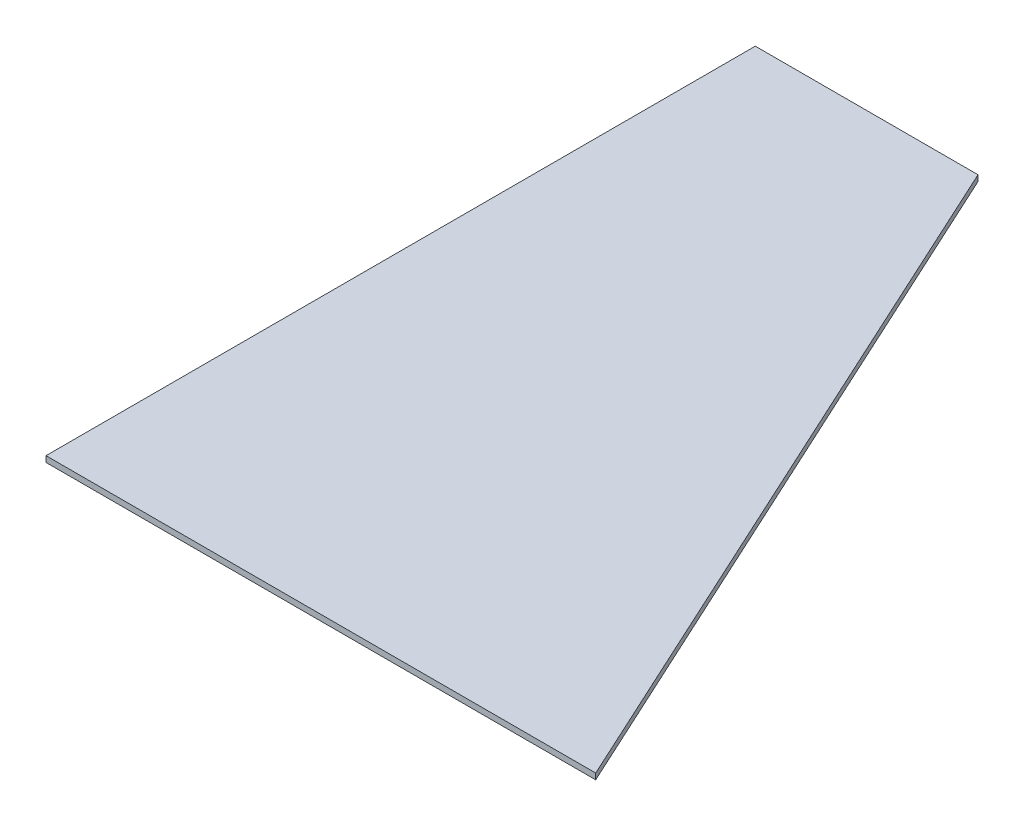
ISO-10303-21;
HEADER;
FILE_DESCRIPTION(('STEP AP214'),'2;1');
FILE_NAME('part.step','',(''),(''),'','','');
FILE_SCHEMA(('AUTOMOTIVE_DESIGN { 1 0 10303 214 1 1 1 1 }'));
ENDSEC;
DATA;
#1=APPLICATION_CONTEXT('core data for automotive mechanical design processes');
#2=APPLICATION_PROTOCOL_DEFINITION('international standard','automotive_design',2000,#1);
#3=PRODUCT_CONTEXT('',#1,'mechanical');
#4=PRODUCT('Part','Part','',(#3));
#5=PRODUCT_RELATED_PRODUCT_CATEGORY('part','',(#4));
#6=PRODUCT_DEFINITION_FORMATION('','',#4);
#7=PRODUCT_DEFINITION_CONTEXT('part definition',#1,'design');
#8=PRODUCT_DEFINITION('design','',#6,#7);
#9=PRODUCT_DEFINITION_SHAPE('','',#8);
#10=(LENGTH_UNIT() NAMED_UNIT(*) SI_UNIT(.MILLI.,.METRE.));
#11=(NAMED_UNIT(*) PLANE_ANGLE_UNIT() SI_UNIT($,.RADIAN.));
#12=(NAMED_UNIT(*) SI_UNIT($,.STERADIAN.) SOLID_ANGLE_UNIT());
#13=UNCERTAINTY_MEASURE_WITH_UNIT(LENGTH_MEASURE(1.E-05),#10,'distance_accuracy_value','');
#14=(GEOMETRIC_REPRESENTATION_CONTEXT(3) GLOBAL_UNCERTAINTY_ASSIGNED_CONTEXT((#13)) GLOBAL_UNIT_ASSIGNED_CONTEXT((#10,
#11,#12)) REPRESENTATION_CONTEXT('',''));
#15=CARTESIAN_POINT('',(0.,0.,0.));
#16=DIRECTION('',(0.,0.,1.));
#17=DIRECTION('',(1.,0.,0.));
#18=AXIS2_PLACEMENT_3D('',#15,#16,#17);
#19=CARTESIAN_POINT('',(0.,6.35,-762.));
#20=DIRECTION('',(1.,0.,0.));
#21=DIRECTION('',(0.,0.,-1.));
#22=AXIS2_PLACEMENT_3D('',#19,#20,#21);
#23=PLANE('',#22);
#24=DIRECTION('',(0.,0.,1.));
#25=VECTOR('',#24,1.);
#26=CARTESIAN_POINT('',(0.,0.,-762.));
#27=LINE('',#26,#25);
#28=CARTESIAN_POINT('',(0.,0.,-762.));
#29=VERTEX_POINT('',#28);
#30=CARTESIAN_POINT('',(0.,0.,0.));
#31=VERTEX_POINT('',#30);
#32=EDGE_CURVE('E100',#29,#31,#27,.T.);
#33=ORIENTED_EDGE('',*,*,#32,.T.);
#34=DIRECTION('',(0.,-1.,0.));
#35=VECTOR('',#34,1.);
#36=CARTESIAN_POINT('',(0.,6.35,0.));
#37=LINE('',#36,#35);
#38=CARTESIAN_POINT('',(0.,6.35,0.));
#39=VERTEX_POINT('',#38);
#40=EDGE_CURVE('E11',#39,#31,#37,.T.);
#41=ORIENTED_EDGE('',*,*,#40,.F.);
#42=DIRECTION('',(0.,0.,1.));
#43=VECTOR('',#42,1.);
#44=CARTESIAN_POINT('',(0.,6.35,-762.));
#45=LINE('',#44,#43);
#46=CARTESIAN_POINT('',(0.,6.35,-762.));
#47=VERTEX_POINT('',#46);
#48=EDGE_CURVE('E88',#47,#39,#45,.T.);
#49=ORIENTED_EDGE('',*,*,#48,.F.);
#50=DIRECTION('',(0.,-1.,0.));
#51=VECTOR('',#50,1.);
#52=CARTESIAN_POINT('',(0.,6.35,-762.));
#53=LINE('',#52,#51);
#54=EDGE_CURVE('E96',#47,#29,#53,.T.);
#55=ORIENTED_EDGE('',*,*,#54,.T.);
#56=EDGE_LOOP('',(#33,#41,#49,#55));
#57=FACE_BOUND('',#56,.T.);
#58=ADVANCED_FACE('F37',(#57),#23,.F.);
#59=CARTESIAN_POINT('',(0.,6.35,0.));
#60=DIRECTION('',(0.,0.,-1.));
#61=DIRECTION('',(-1.,0.,0.));
#62=AXIS2_PLACEMENT_3D('',#59,#60,#61);
#63=PLANE('',#62);
#64=DIRECTION('',(1.,0.,0.));
#65=VECTOR('',#64,1.);
#66=CARTESIAN_POINT('',(0.,0.,0.));
#67=LINE('',#66,#65);
#68=CARTESIAN_POINT('',(590.55,0.,0.));
#69=VERTEX_POINT('',#68);
#70=EDGE_CURVE('E92',#31,#69,#67,.T.);
#71=ORIENTED_EDGE('',*,*,#70,.T.);
#72=DIRECTION('',(0.,-1.,0.));
#73=VECTOR('',#72,1.);
#74=CARTESIAN_POINT('',(590.55,6.35,0.));
#75=LINE('',#74,#73);
#76=CARTESIAN_POINT('',(590.55,6.35,0.));
#77=VERTEX_POINT('',#76);
#78=EDGE_CURVE('E45',#77,#69,#75,.T.);
#79=ORIENTED_EDGE('',*,*,#78,.F.);
#80=DIRECTION('',(1.,0.,0.));
#81=VECTOR('',#80,1.);
#82=CARTESIAN_POINT('',(0.,6.35,0.));
#83=LINE('',#82,#81);
#84=EDGE_CURVE('E83',#39,#77,#83,.T.);
#85=ORIENTED_EDGE('',*,*,#84,.F.);
#86=ORIENTED_EDGE('',*,*,#40,.T.);
#87=EDGE_LOOP('',(#71,#79,#85,#86));
#88=FACE_BOUND('',#87,.T.);
#89=ADVANCED_FACE('F91',(#88),#63,.F.);
#90=CARTESIAN_POINT('',(590.55,6.35,0.));
#91=DIRECTION('',(-0.908143173825079,0.,0.418659737537432));
#92=DIRECTION('',(0.418659737537432,0.,0.908143173825079));
#93=AXIS2_PLACEMENT_3D('',#90,#91,#92);
#94=PLANE('',#93);
#95=DIRECTION('',(-0.418659737537432,0.,-0.90814317382508));
#96=VECTOR('',#95,1.);
#97=CARTESIAN_POINT('',(590.55,0.,0.));
#98=LINE('',#97,#96);
#99=CARTESIAN_POINT('',(239.26318840638,0.,-762.));
#100=VERTEX_POINT('',#99);
#101=EDGE_CURVE('E70',#69,#100,#98,.T.);
#102=ORIENTED_EDGE('',*,*,#101,.T.);
#103=DIRECTION('',(0.,-1.,0.));
#104=VECTOR('',#103,1.);
#105=CARTESIAN_POINT('',(239.26318840638,6.35,-762.));
#106=LINE('',#105,#104);
#107=CARTESIAN_POINT('',(239.26318840638,6.35,-762.));
#108=VERTEX_POINT('',#107);
#109=EDGE_CURVE('E93',#108,#100,#106,.T.);
#110=ORIENTED_EDGE('',*,*,#109,.F.);
#111=DIRECTION('',(-0.418659737537432,0.,-0.90814317382508));
#112=VECTOR('',#111,1.);
#113=CARTESIAN_POINT('',(590.55,6.35,0.));
#114=LINE('',#113,#112);
#115=EDGE_CURVE('E86',#77,#108,#114,.T.);
#116=ORIENTED_EDGE('',*,*,#115,.F.);
#117=ORIENTED_EDGE('',*,*,#78,.T.);
#118=EDGE_LOOP('',(#102,#110,#116,#117));
#119=FACE_BOUND('',#118,.T.);
#120=ADVANCED_FACE('F94',(#119),#94,.F.);
#121=CARTESIAN_POINT('',(239.26318840638,6.35,-762.));
#122=DIRECTION('',(0.,0.,1.));
#123=DIRECTION('',(1.,0.,0.));
#124=AXIS2_PLACEMENT_3D('',#121,#122,#123);
#125=PLANE('',#124);
#126=DIRECTION('',(-1.,0.,0.));
#127=VECTOR('',#126,1.);
#128=CARTESIAN_POINT('',(239.26318840638,0.,-762.));
#129=LINE('',#128,#127);
#130=EDGE_CURVE('E76',#100,#29,#129,.T.);
#131=ORIENTED_EDGE('',*,*,#130,.T.);
#132=ORIENTED_EDGE('',*,*,#54,.F.);
#133=DIRECTION('',(-1.,0.,0.));
#134=VECTOR('',#133,1.);
#135=CARTESIAN_POINT('',(239.26318840638,6.35,-762.));
#136=LINE('',#135,#134);
#137=EDGE_CURVE('E53',#108,#47,#136,.T.);
#138=ORIENTED_EDGE('',*,*,#137,.F.);
#139=ORIENTED_EDGE('',*,*,#109,.T.);
#140=EDGE_LOOP('',(#131,#132,#138,#139));
#141=FACE_BOUND('',#140,.T.);
#142=ADVANCED_FACE('F107',(#141),#125,.F.);
#143=CARTESIAN_POINT('',(0.,6.35,0.));
#144=DIRECTION('',(0.,1.,0.));
#145=DIRECTION('',(0.,0.,1.));
#146=AXIS2_PLACEMENT_3D('',#143,#144,#145);
#147=PLANE('',#146);
#148=ORIENTED_EDGE('',*,*,#48,.T.);
#149=ORIENTED_EDGE('',*,*,#84,.T.);
#150=ORIENTED_EDGE('',*,*,#115,.T.);
#151=ORIENTED_EDGE('',*,*,#137,.T.);
#152=EDGE_LOOP('',(#148,#149,#150,#151));
#153=FACE_BOUND('',#152,.T.);
#154=ADVANCED_FACE('F84',(#153),#147,.T.);
#155=CARTESIAN_POINT('',(0.,0.,0.));
#156=DIRECTION('',(0.,1.,0.));
#157=DIRECTION('',(0.,0.,1.));
#158=AXIS2_PLACEMENT_3D('',#155,#156,#157);
#159=PLANE('',#158);
#160=ORIENTED_EDGE('',*,*,#32,.F.);
#161=ORIENTED_EDGE('',*,*,#130,.F.);
#162=ORIENTED_EDGE('',*,*,#101,.F.);
#163=ORIENTED_EDGE('',*,*,#70,.F.);
#164=EDGE_LOOP('',(#160,#161,#162,#163));
#165=FACE_BOUND('',#164,.T.);
#166=ADVANCED_FACE('F110',(#165),#159,.F.);
#167=CLOSED_SHELL('',(#58,#89,#120,#142,#154,#166));
#168=MANIFOLD_SOLID_BREP('B2',#167);
#169=ADVANCED_BREP_SHAPE_REPRESENTATION('',(#18,#168),#14);
#170=SHAPE_DEFINITION_REPRESENTATION(#9,#169);
ENDSEC;
END-ISO-10303-21;
